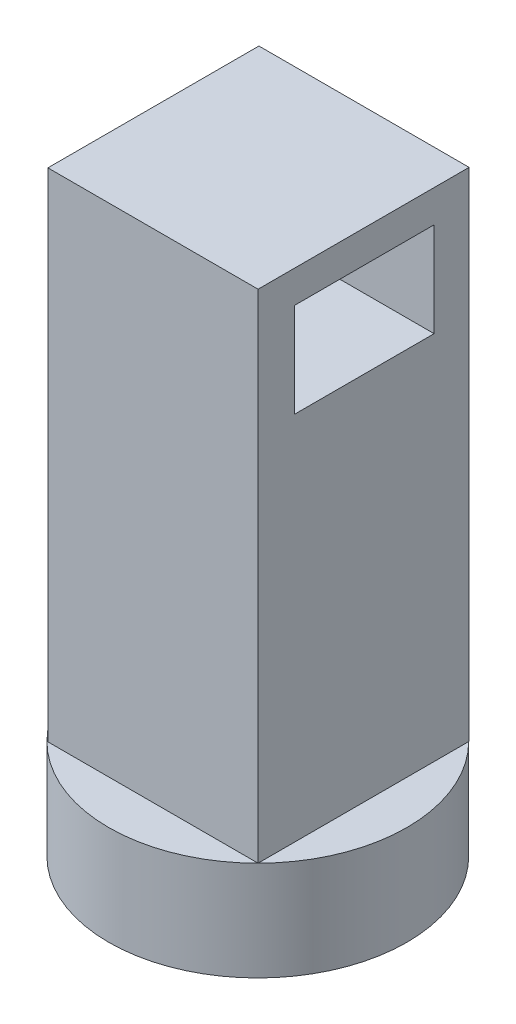
ISO-10303-21;
HEADER;
FILE_DESCRIPTION(('STEP AP214'),'2;1');
FILE_NAME('part.step','',(''),(''),'','','');
FILE_SCHEMA(('AUTOMOTIVE_DESIGN { 1 0 10303 214 1 1 1 1 }'));
ENDSEC;
DATA;
#1=APPLICATION_CONTEXT('core data for automotive mechanical design processes');
#2=APPLICATION_PROTOCOL_DEFINITION('international standard','automotive_design',2000,#1);
#3=PRODUCT_CONTEXT('',#1,'mechanical');
#4=PRODUCT('Part','Part','',(#3));
#5=PRODUCT_RELATED_PRODUCT_CATEGORY('part','',(#4));
#6=PRODUCT_DEFINITION_FORMATION('','',#4);
#7=PRODUCT_DEFINITION_CONTEXT('part definition',#1,'design');
#8=PRODUCT_DEFINITION('design','',#6,#7);
#9=PRODUCT_DEFINITION_SHAPE('','',#8);
#10=(LENGTH_UNIT() NAMED_UNIT(*) SI_UNIT(.MILLI.,.METRE.));
#11=(NAMED_UNIT(*) PLANE_ANGLE_UNIT() SI_UNIT($,.RADIAN.));
#12=(NAMED_UNIT(*) SI_UNIT($,.STERADIAN.) SOLID_ANGLE_UNIT());
#13=UNCERTAINTY_MEASURE_WITH_UNIT(LENGTH_MEASURE(1.E-05),#10,'distance_accuracy_value','');
#14=(GEOMETRIC_REPRESENTATION_CONTEXT(3) GLOBAL_UNCERTAINTY_ASSIGNED_CONTEXT((#13)) GLOBAL_UNIT_ASSIGNED_CONTEXT((#10,
#11,#12)) REPRESENTATION_CONTEXT('',''));
#15=CARTESIAN_POINT('',(0.,0.,0.));
#16=DIRECTION('',(0.,0.,1.));
#17=DIRECTION('',(1.,0.,0.));
#18=AXIS2_PLACEMENT_3D('',#15,#16,#17);
#19=CARTESIAN_POINT('',(0.,2.54,0.));
#20=DIRECTION('',(0.,1.,0.));
#21=DIRECTION('',(0.,0.,1.));
#22=AXIS2_PLACEMENT_3D('',#19,#20,#21);
#23=PLANE('',#22);
#24=DIRECTION('',(0.,0.,1.));
#25=VECTOR('',#24,1.);
#26=CARTESIAN_POINT('',(-2.67203035970738,2.54,-2.70055494435203));
#27=LINE('',#26,#25);
#28=CARTESIAN_POINT('',(-2.67203035970738,2.54,-2.70055494435203));
#29=VERTEX_POINT('',#28);
#30=CARTESIAN_POINT('',(-2.67203035970738,2.54,2.69061627925835));
#31=VERTEX_POINT('',#30);
#32=EDGE_CURVE('E136',#29,#31,#27,.T.);
#33=ORIENTED_EDGE('',*,*,#32,.F.);
#34=DIRECTION('',(1.,0.,0.));
#35=VECTOR('',#34,1.);
#36=CARTESIAN_POINT('',(-2.67203035970738,2.54,-2.70055494435203));
#37=LINE('',#36,#35);
#38=CARTESIAN_POINT('',(2.6875831136052,2.54,-2.70055494435203));
#39=VERTEX_POINT('',#38);
#40=EDGE_CURVE('E151',#29,#39,#37,.T.);
#41=ORIENTED_EDGE('',*,*,#40,.T.);
#42=CARTESIAN_POINT('',(0.,2.54,0.));
#43=DIRECTION('',(0.,1.,0.));
#44=DIRECTION('',(0.,0.,1.));
#45=AXIS2_PLACEMENT_3D('',#42,#43,#44);
#46=CIRCLE('',#45,3.81);
#47=CARTESIAN_POINT('',(2.69753295397664,2.54,2.69061627925835));
#48=VERTEX_POINT('',#47);
#49=EDGE_CURVE('E176',#39,#48,#46,.T.);
#50=ORIENTED_EDGE('',*,*,#49,.T.);
#51=DIRECTION('',(1.,0.,0.));
#52=VECTOR('',#51,1.);
#53=CARTESIAN_POINT('',(-2.67203035970738,2.54,2.69061627925835));
#54=LINE('',#53,#52);
#55=EDGE_CURVE('E130',#31,#48,#54,.T.);
#56=ORIENTED_EDGE('',*,*,#55,.F.);
#57=EDGE_LOOP('',(#33,#41,#50,#56));
#58=FACE_BOUND('',#57,.T.);
#59=ADVANCED_FACE('F33',(#58),#23,.T.);
#60=CARTESIAN_POINT('',(2.69753295397664,2.54,-2.69061627925836));
#61=VERTEX_POINT('',#60);
#62=EDGE_CURVE('E172',#48,#61,#46,.T.);
#63=ORIENTED_EDGE('',*,*,#62,.T.);
#64=DIRECTION('',(0.,0.,1.));
#65=VECTOR('',#64,1.);
#66=CARTESIAN_POINT('',(2.69753295397664,2.54,-2.70055494435203));
#67=LINE('',#66,#65);
#68=EDGE_CURVE('E150',#61,#48,#67,.T.);
#69=ORIENTED_EDGE('',*,*,#68,.T.);
#70=EDGE_LOOP('',(#63,#69));
#71=FACE_BOUND('',#70,.T.);
#72=ADVANCED_FACE('F203',(#71),#23,.T.);
#73=CARTESIAN_POINT('',(0.,2.54,0.));
#74=DIRECTION('',(0.,-1.,0.));
#75=DIRECTION('',(0.,0.,-1.));
#76=AXIS2_PLACEMENT_3D('',#73,#74,#75);
#77=CYLINDRICAL_SURFACE('',#76,3.81);
#78=ORIENTED_EDGE('',*,*,#62,.F.);
#79=ORIENTED_EDGE('',*,*,#49,.F.);
#80=EDGE_CURVE('E175',#61,#39,#46,.T.);
#81=ORIENTED_EDGE('',*,*,#80,.F.);
#82=EDGE_LOOP('',(#78,#79,#81));
#83=FACE_BOUND('',#82,.T.);
#84=CARTESIAN_POINT('',(0.,0.,0.));
#85=DIRECTION('',(0.,1.,0.));
#86=DIRECTION('',(0.,0.,1.));
#87=AXIS2_PLACEMENT_3D('',#84,#85,#86);
#88=CIRCLE('',#87,3.81);
#89=CARTESIAN_POINT('',(0.,0.,3.81));
#90=VERTEX_POINT('',#89);
#91=EDGE_CURVE('E169',#90,#90,#88,.T.);
#92=ORIENTED_EDGE('',*,*,#91,.T.);
#93=EDGE_LOOP('',(#92));
#94=FACE_BOUND('',#93,.T.);
#95=ADVANCED_FACE('F35',(#83,#94),#77,.T.);
#96=CARTESIAN_POINT('',(0.,0.,0.));
#97=DIRECTION('',(0.,1.,0.));
#98=DIRECTION('',(0.,0.,1.));
#99=AXIS2_PLACEMENT_3D('',#96,#97,#98);
#100=PLANE('',#99);
#101=CARTESIAN_POINT('',(0.,0.,0.));
#102=DIRECTION('',(0.,-1.,0.));
#103=DIRECTION('',(0.,0.,-1.));
#104=AXIS2_PLACEMENT_3D('',#101,#102,#103);
#105=CIRCLE('',#104,1.905);
#106=CARTESIAN_POINT('',(0.,0.,-1.905));
#107=VERTEX_POINT('',#106);
#108=EDGE_CURVE('E165',#107,#107,#105,.T.);
#109=ORIENTED_EDGE('',*,*,#108,.F.);
#110=EDGE_LOOP('',(#109));
#111=FACE_BOUND('',#110,.T.);
#112=ORIENTED_EDGE('',*,*,#91,.F.);
#113=EDGE_LOOP('',(#112));
#114=FACE_BOUND('',#113,.T.);
#115=ADVANCED_FACE('F214',(#111,#114),#100,.F.);
#116=CARTESIAN_POINT('',(0.,1.27,0.));
#117=DIRECTION('',(0.,-1.,0.));
#118=DIRECTION('',(0.,0.,-1.));
#119=AXIS2_PLACEMENT_3D('',#116,#117,#118);
#120=CYLINDRICAL_SURFACE('',#119,1.905);
#121=CARTESIAN_POINT('',(0.,1.27,0.));
#122=DIRECTION('',(0.,-1.,0.));
#123=DIRECTION('',(0.,0.,-1.));
#124=AXIS2_PLACEMENT_3D('',#121,#122,#123);
#125=CIRCLE('',#124,1.905);
#126=CARTESIAN_POINT('',(0.,1.27,-1.905));
#127=VERTEX_POINT('',#126);
#128=EDGE_CURVE('E166',#127,#127,#125,.T.);
#129=ORIENTED_EDGE('',*,*,#128,.F.);
#130=EDGE_LOOP('',(#129));
#131=FACE_BOUND('',#130,.T.);
#132=ORIENTED_EDGE('',*,*,#108,.T.);
#133=EDGE_LOOP('',(#132));
#134=FACE_BOUND('',#133,.T.);
#135=ADVANCED_FACE('F212',(#131,#134),#120,.F.);
#136=CARTESIAN_POINT('',(0.,1.27,0.));
#137=DIRECTION('',(0.,-1.,0.));
#138=DIRECTION('',(0.,0.,-1.));
#139=AXIS2_PLACEMENT_3D('',#136,#137,#138);
#140=PLANE('',#139);
#141=ORIENTED_EDGE('',*,*,#128,.T.);
#142=EDGE_LOOP('',(#141));
#143=FACE_BOUND('',#142,.T.);
#144=ADVANCED_FACE('F221',(#143),#140,.T.);
#145=CARTESIAN_POINT('',(-2.67203035970738,15.24,2.69061627925835));
#146=DIRECTION('',(0.,0.,-1.));
#147=DIRECTION('',(-1.,0.,0.));
#148=AXIS2_PLACEMENT_3D('',#145,#146,#147);
#149=PLANE('',#148);
#150=ORIENTED_EDGE('',*,*,#55,.T.);
#151=DIRECTION('',(0.,-1.,0.));
#152=VECTOR('',#151,1.);
#153=CARTESIAN_POINT('',(2.69753295397664,15.24,2.69061627925835));
#154=LINE('',#153,#152);
#155=CARTESIAN_POINT('',(2.69753295397664,15.24,2.69061627925835));
#156=VERTEX_POINT('',#155);
#157=EDGE_CURVE('E162',#156,#48,#154,.T.);
#158=ORIENTED_EDGE('',*,*,#157,.F.);
#159=DIRECTION('',(1.,0.,0.));
#160=VECTOR('',#159,1.);
#161=CARTESIAN_POINT('',(-2.67203035970738,15.24,2.69061627925835));
#162=LINE('',#161,#160);
#163=CARTESIAN_POINT('',(-2.67203035970738,15.24,2.69061627925835));
#164=VERTEX_POINT('',#163);
#165=EDGE_CURVE('E133',#164,#156,#162,.T.);
#166=ORIENTED_EDGE('',*,*,#165,.F.);
#167=DIRECTION('',(0.,-1.,0.));
#168=VECTOR('',#167,1.);
#169=CARTESIAN_POINT('',(-2.67203035970738,15.24,2.69061627925835));
#170=LINE('',#169,#168);
#171=EDGE_CURVE('E144',#164,#31,#170,.T.);
#172=ORIENTED_EDGE('',*,*,#171,.T.);
#173=EDGE_LOOP('',(#150,#158,#166,#172));
#174=FACE_BOUND('',#173,.T.);
#175=ADVANCED_FACE('F245',(#174),#149,.F.);
#176=CARTESIAN_POINT('',(2.69753295397664,15.24,-2.70055494435203));
#177=DIRECTION('',(1.,0.,0.));
#178=DIRECTION('',(0.,0.,-1.));
#179=AXIS2_PLACEMENT_3D('',#176,#177,#178);
#180=PLANE('',#179);
#181=DIRECTION('',(0.,-1.,0.));
#182=VECTOR('',#181,1.);
#183=CARTESIAN_POINT('',(2.69753295397664,14.4157670520997,1.75453695275962));
#184=LINE('',#183,#182);
#185=CARTESIAN_POINT('',(2.69753295397664,14.4157670520997,1.75453695275962));
#186=VERTEX_POINT('',#185);
#187=CARTESIAN_POINT('',(2.69753295397664,12.0070765498497,1.75453695275962));
#188=VERTEX_POINT('',#187);
#189=EDGE_CURVE('E48',#186,#188,#184,.T.);
#190=ORIENTED_EDGE('',*,*,#189,.F.);
#191=DIRECTION('',(0.,0.,1.));
#192=VECTOR('',#191,1.);
#193=CARTESIAN_POINT('',(2.69753295397664,14.4157670520997,1.75453695275962));
#194=LINE('',#193,#192);
#195=CARTESIAN_POINT('',(2.69753295397664,14.4157670520997,-1.80677797073514));
#196=VERTEX_POINT('',#195);
#197=EDGE_CURVE('E123',#196,#186,#194,.T.);
#198=ORIENTED_EDGE('',*,*,#197,.F.);
#199=DIRECTION('',(0.,1.,0.));
#200=VECTOR('',#199,1.);
#201=CARTESIAN_POINT('',(2.69753295397664,14.4157670520997,-1.80677797073514));
#202=LINE('',#201,#200);
#203=CARTESIAN_POINT('',(2.69753295397664,12.0070765498497,-1.80677797073514));
#204=VERTEX_POINT('',#203);
#205=EDGE_CURVE('E107',#204,#196,#202,.T.);
#206=ORIENTED_EDGE('',*,*,#205,.F.);
#207=DIRECTION('',(0.,0.,-1.));
#208=VECTOR('',#207,1.);
#209=CARTESIAN_POINT('',(2.69753295397664,12.0070765498497,1.75453695275962));
#210=LINE('',#209,#208);
#211=EDGE_CURVE('E116',#188,#204,#210,.T.);
#212=ORIENTED_EDGE('',*,*,#211,.F.);
#213=EDGE_LOOP('',(#190,#198,#206,#212));
#214=FACE_BOUND('',#213,.T.);
#215=CARTESIAN_POINT('',(2.69753295397664,2.54,-2.70055494435203));
#216=VERTEX_POINT('',#215);
#217=EDGE_CURVE('E146',#216,#61,#67,.T.);
#218=ORIENTED_EDGE('',*,*,#217,.F.);
#219=DIRECTION('',(0.,-1.,0.));
#220=VECTOR('',#219,1.);
#221=CARTESIAN_POINT('',(2.69753295397664,15.24,-2.70055494435203));
#222=LINE('',#221,#220);
#223=CARTESIAN_POINT('',(2.69753295397664,15.24,-2.70055494435203));
#224=VERTEX_POINT('',#223);
#225=EDGE_CURVE('E159',#224,#216,#222,.T.);
#226=ORIENTED_EDGE('',*,*,#225,.F.);
#227=DIRECTION('',(0.,0.,1.));
#228=VECTOR('',#227,1.);
#229=CARTESIAN_POINT('',(2.69753295397664,15.24,-2.70055494435203));
#230=LINE('',#229,#228);
#231=EDGE_CURVE('E135',#224,#156,#230,.T.);
#232=ORIENTED_EDGE('',*,*,#231,.T.);
#233=ORIENTED_EDGE('',*,*,#157,.T.);
#234=ORIENTED_EDGE('',*,*,#68,.F.);
#235=EDGE_LOOP('',(#218,#226,#232,#233,#234));
#236=FACE_BOUND('',#235,.T.);
#237=ADVANCED_FACE('F120',(#214,#236),#180,.T.);
#238=CARTESIAN_POINT('',(-2.67203035970738,15.24,-2.70055494435203));
#239=DIRECTION('',(0.,0.,-1.));
#240=DIRECTION('',(-1.,0.,0.));
#241=AXIS2_PLACEMENT_3D('',#238,#239,#240);
#242=PLANE('',#241);
#243=ORIENTED_EDGE('',*,*,#40,.F.);
#244=DIRECTION('',(0.,-1.,0.));
#245=VECTOR('',#244,1.);
#246=CARTESIAN_POINT('',(-2.67203035970738,15.24,-2.70055494435203));
#247=LINE('',#246,#245);
#248=CARTESIAN_POINT('',(-2.67203035970738,15.24,-2.70055494435203));
#249=VERTEX_POINT('',#248);
#250=EDGE_CURVE('E157',#249,#29,#247,.T.);
#251=ORIENTED_EDGE('',*,*,#250,.F.);
#252=DIRECTION('',(1.,0.,0.));
#253=VECTOR('',#252,1.);
#254=CARTESIAN_POINT('',(-2.67203035970738,15.24,-2.70055494435203));
#255=LINE('',#254,#253);
#256=EDGE_CURVE('E139',#249,#224,#255,.T.);
#257=ORIENTED_EDGE('',*,*,#256,.T.);
#258=ORIENTED_EDGE('',*,*,#225,.T.);
#259=EDGE_CURVE('E149',#39,#216,#37,.T.);
#260=ORIENTED_EDGE('',*,*,#259,.F.);
#261=EDGE_LOOP('',(#243,#251,#257,#258,#260));
#262=FACE_BOUND('',#261,.T.);
#263=ADVANCED_FACE('F241',(#262),#242,.T.);
#264=CARTESIAN_POINT('',(-2.67203035970738,15.24,-2.70055494435203));
#265=DIRECTION('',(1.,0.,0.));
#266=DIRECTION('',(0.,0.,-1.));
#267=AXIS2_PLACEMENT_3D('',#264,#265,#266);
#268=PLANE('',#267);
#269=DIRECTION('',(0.,0.,1.));
#270=VECTOR('',#269,1.);
#271=CARTESIAN_POINT('',(-2.67203035970738,14.4157670520997,-2.70055494435203));
#272=LINE('',#271,#270);
#273=CARTESIAN_POINT('',(-2.67203035970738,14.4157670520997,-1.80677797073514));
#274=VERTEX_POINT('',#273);
#275=CARTESIAN_POINT('',(-2.67203035970738,14.4157670520997,1.75453695275962));
#276=VERTEX_POINT('',#275);
#277=EDGE_CURVE('E41',#274,#276,#272,.T.);
#278=ORIENTED_EDGE('',*,*,#277,.T.);
#279=DIRECTION('',(0.,-1.,0.));
#280=VECTOR('',#279,1.);
#281=CARTESIAN_POINT('',(-2.67203035970738,15.24,1.75453695275962));
#282=LINE('',#281,#280);
#283=CARTESIAN_POINT('',(-2.67203035970738,12.0070765498497,1.75453695275962));
#284=VERTEX_POINT('',#283);
#285=EDGE_CURVE('E11',#276,#284,#282,.T.);
#286=ORIENTED_EDGE('',*,*,#285,.T.);
#287=DIRECTION('',(0.,0.,-1.));
#288=VECTOR('',#287,1.);
#289=CARTESIAN_POINT('',(-2.67203035970738,12.0070765498497,-2.70055494435203));
#290=LINE('',#289,#288);
#291=CARTESIAN_POINT('',(-2.67203035970738,12.0070765498497,-1.80677797073514));
#292=VERTEX_POINT('',#291);
#293=EDGE_CURVE('E179',#284,#292,#290,.T.);
#294=ORIENTED_EDGE('',*,*,#293,.T.);
#295=DIRECTION('',(0.,1.,0.));
#296=VECTOR('',#295,1.);
#297=CARTESIAN_POINT('',(-2.67203035970738,15.24,-1.80677797073514));
#298=LINE('',#297,#296);
#299=EDGE_CURVE('E110',#292,#274,#298,.T.);
#300=ORIENTED_EDGE('',*,*,#299,.T.);
#301=EDGE_LOOP('',(#278,#286,#294,#300));
#302=FACE_BOUND('',#301,.T.);
#303=ORIENTED_EDGE('',*,*,#32,.T.);
#304=ORIENTED_EDGE('',*,*,#171,.F.);
#305=DIRECTION('',(0.,0.,1.));
#306=VECTOR('',#305,1.);
#307=CARTESIAN_POINT('',(-2.67203035970738,15.24,-2.70055494435203));
#308=LINE('',#307,#306);
#309=EDGE_CURVE('E142',#249,#164,#308,.T.);
#310=ORIENTED_EDGE('',*,*,#309,.F.);
#311=ORIENTED_EDGE('',*,*,#250,.T.);
#312=EDGE_LOOP('',(#303,#304,#310,#311));
#313=FACE_BOUND('',#312,.T.);
#314=ADVANCED_FACE('F183',(#302,#313),#268,.F.);
#315=CARTESIAN_POINT('',(0.,15.24,0.));
#316=DIRECTION('',(0.,-1.,0.));
#317=DIRECTION('',(0.,0.,-1.));
#318=AXIS2_PLACEMENT_3D('',#315,#316,#317);
#319=PLANE('',#318);
#320=ORIENTED_EDGE('',*,*,#165,.T.);
#321=ORIENTED_EDGE('',*,*,#231,.F.);
#322=ORIENTED_EDGE('',*,*,#256,.F.);
#323=ORIENTED_EDGE('',*,*,#309,.T.);
#324=EDGE_LOOP('',(#320,#321,#322,#323));
#325=FACE_BOUND('',#324,.T.);
#326=ADVANCED_FACE('F197',(#325),#319,.F.);
#327=CARTESIAN_POINT('',(0.,2.54,0.));
#328=DIRECTION('',(0.,-1.,0.));
#329=DIRECTION('',(0.,0.,-1.));
#330=AXIS2_PLACEMENT_3D('',#327,#328,#329);
#331=PLANE('',#330);
#332=ORIENTED_EDGE('',*,*,#217,.T.);
#333=ORIENTED_EDGE('',*,*,#80,.T.);
#334=ORIENTED_EDGE('',*,*,#259,.T.);
#335=EDGE_LOOP('',(#332,#333,#334));
#336=FACE_BOUND('',#335,.T.);
#337=ADVANCED_FACE('F190',(#336),#331,.T.);
#338=CARTESIAN_POINT('',(-10.0024670460234,14.4157670520997,1.75453695275962));
#339=DIRECTION('',(0.,0.,1.));
#340=DIRECTION('',(1.,0.,0.));
#341=AXIS2_PLACEMENT_3D('',#338,#339,#340);
#342=PLANE('',#341);
#343=DIRECTION('',(1.,0.,0.));
#344=VECTOR('',#343,1.);
#345=CARTESIAN_POINT('',(-10.0024670460234,14.4157670520997,1.75453695275962));
#346=LINE('',#345,#344);
#347=EDGE_CURVE('E128',#276,#186,#346,.T.);
#348=ORIENTED_EDGE('',*,*,#347,.T.);
#349=ORIENTED_EDGE('',*,*,#189,.T.);
#350=DIRECTION('',(1.,0.,0.));
#351=VECTOR('',#350,1.);
#352=CARTESIAN_POINT('',(-10.0024670460234,12.0070765498497,1.75453695275962));
#353=LINE('',#352,#351);
#354=EDGE_CURVE('E113',#284,#188,#353,.T.);
#355=ORIENTED_EDGE('',*,*,#354,.F.);
#356=ORIENTED_EDGE('',*,*,#285,.F.);
#357=EDGE_LOOP('',(#348,#349,#355,#356));
#358=FACE_BOUND('',#357,.T.);
#359=ADVANCED_FACE('F188',(#358),#342,.F.);
#360=CARTESIAN_POINT('',(-10.0024670460234,14.4157670520997,1.75453695275962));
#361=DIRECTION('',(0.,1.,0.));
#362=DIRECTION('',(0.,0.,1.));
#363=AXIS2_PLACEMENT_3D('',#360,#361,#362);
#364=PLANE('',#363);
#365=DIRECTION('',(1.,0.,0.));
#366=VECTOR('',#365,1.);
#367=CARTESIAN_POINT('',(-10.0024670460234,14.4157670520997,-1.80677797073514));
#368=LINE('',#367,#366);
#369=EDGE_CURVE('E112',#274,#196,#368,.T.);
#370=ORIENTED_EDGE('',*,*,#369,.T.);
#371=ORIENTED_EDGE('',*,*,#197,.T.);
#372=ORIENTED_EDGE('',*,*,#347,.F.);
#373=ORIENTED_EDGE('',*,*,#277,.F.);
#374=EDGE_LOOP('',(#370,#371,#372,#373));
#375=FACE_BOUND('',#374,.T.);
#376=ADVANCED_FACE('F187',(#375),#364,.F.);
#377=CARTESIAN_POINT('',(-10.0024670460234,14.4157670520997,-1.80677797073514));
#378=DIRECTION('',(0.,0.,-1.));
#379=DIRECTION('',(-1.,0.,0.));
#380=AXIS2_PLACEMENT_3D('',#377,#378,#379);
#381=PLANE('',#380);
#382=DIRECTION('',(1.,0.,0.));
#383=VECTOR('',#382,1.);
#384=CARTESIAN_POINT('',(-10.0024670460234,12.0070765498497,-1.80677797073514));
#385=LINE('',#384,#383);
#386=EDGE_CURVE('E56',#292,#204,#385,.T.);
#387=ORIENTED_EDGE('',*,*,#386,.T.);
#388=ORIENTED_EDGE('',*,*,#205,.T.);
#389=ORIENTED_EDGE('',*,*,#369,.F.);
#390=ORIENTED_EDGE('',*,*,#299,.F.);
#391=EDGE_LOOP('',(#387,#388,#389,#390));
#392=FACE_BOUND('',#391,.T.);
#393=ADVANCED_FACE('F104',(#392),#381,.F.);
#394=CARTESIAN_POINT('',(-10.0024670460234,12.0070765498497,1.75453695275962));
#395=DIRECTION('',(0.,-1.,0.));
#396=DIRECTION('',(0.,0.,-1.));
#397=AXIS2_PLACEMENT_3D('',#394,#395,#396);
#398=PLANE('',#397);
#399=ORIENTED_EDGE('',*,*,#354,.T.);
#400=ORIENTED_EDGE('',*,*,#211,.T.);
#401=ORIENTED_EDGE('',*,*,#386,.F.);
#402=ORIENTED_EDGE('',*,*,#293,.F.);
#403=EDGE_LOOP('',(#399,#400,#401,#402));
#404=FACE_BOUND('',#403,.T.);
#405=ADVANCED_FACE('F117',(#404),#398,.F.);
#406=CLOSED_SHELL('',(#59,#72,#95,#115,#135,#144,#175,#237,#263,#314,#326,#337,#359,#376,#393,#405));
#407=MANIFOLD_SOLID_BREP('B2',#406);
#408=ADVANCED_BREP_SHAPE_REPRESENTATION('',(#18,#407),#14);
#409=SHAPE_DEFINITION_REPRESENTATION(#9,#408);
ENDSEC;
END-ISO-10303-21;
